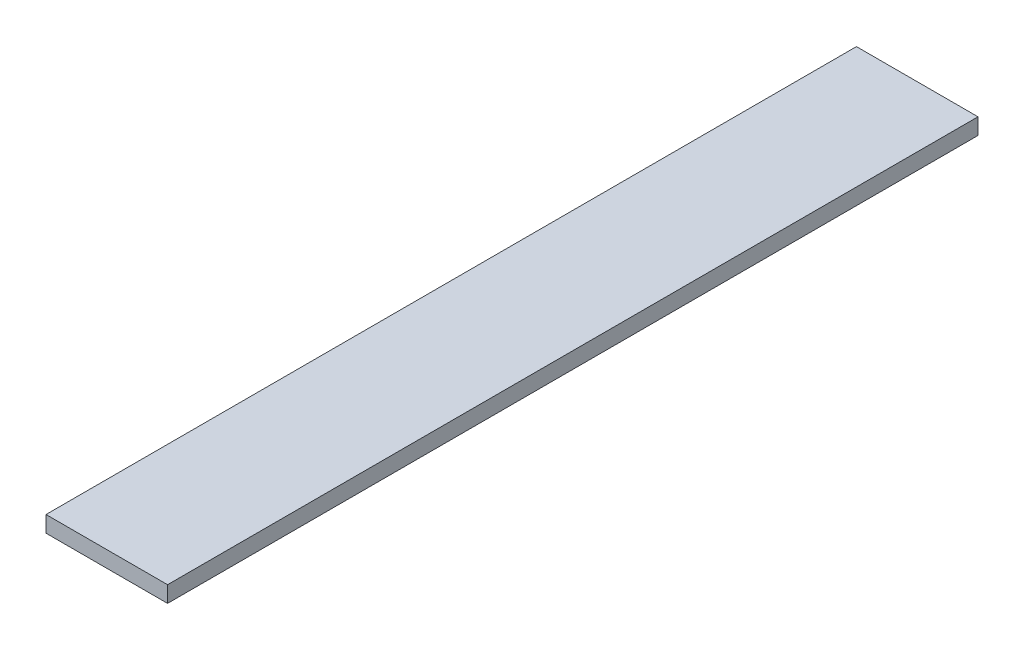
ISO-10303-21;
HEADER;
FILE_DESCRIPTION(('STEP AP214'),'2;1');
FILE_NAME('part.step','',(''),(''),'','','');
FILE_SCHEMA(('AUTOMOTIVE_DESIGN { 1 0 10303 214 1 1 1 1 }'));
ENDSEC;
DATA;
#1=APPLICATION_CONTEXT('core data for automotive mechanical design processes');
#2=APPLICATION_PROTOCOL_DEFINITION('international standard','automotive_design',2000,#1);
#3=PRODUCT_CONTEXT('',#1,'mechanical');
#4=PRODUCT('Part','Part','',(#3));
#5=PRODUCT_RELATED_PRODUCT_CATEGORY('part','',(#4));
#6=PRODUCT_DEFINITION_FORMATION('','',#4);
#7=PRODUCT_DEFINITION_CONTEXT('part definition',#1,'design');
#8=PRODUCT_DEFINITION('design','',#6,#7);
#9=PRODUCT_DEFINITION_SHAPE('','',#8);
#10=(LENGTH_UNIT() NAMED_UNIT(*) SI_UNIT(.MILLI.,.METRE.));
#11=(NAMED_UNIT(*) PLANE_ANGLE_UNIT() SI_UNIT($,.RADIAN.));
#12=(NAMED_UNIT(*) SI_UNIT($,.STERADIAN.) SOLID_ANGLE_UNIT());
#13=UNCERTAINTY_MEASURE_WITH_UNIT(LENGTH_MEASURE(1.E-05),#10,'distance_accuracy_value','');
#14=(GEOMETRIC_REPRESENTATION_CONTEXT(3) GLOBAL_UNCERTAINTY_ASSIGNED_CONTEXT((#13)) GLOBAL_UNIT_ASSIGNED_CONTEXT((#10,
#11,#12)) REPRESENTATION_CONTEXT('',''));
#15=CARTESIAN_POINT('',(0.,0.,0.));
#16=DIRECTION('',(0.,0.,1.));
#17=DIRECTION('',(1.,0.,0.));
#18=AXIS2_PLACEMENT_3D('',#15,#16,#17);
#19=CARTESIAN_POINT('',(75.,-10.,500.));
#20=DIRECTION('',(-1.,0.,0.));
#21=DIRECTION('',(0.,0.,1.));
#22=AXIS2_PLACEMENT_3D('',#19,#20,#21);
#23=PLANE('',#22);
#24=DIRECTION('',(0.,1.,0.));
#25=VECTOR('',#24,1.);
#26=CARTESIAN_POINT('',(75.,-10.,-500.));
#27=LINE('',#26,#25);
#28=CARTESIAN_POINT('',(75.,-10.,-500.));
#29=VERTEX_POINT('',#28);
#30=CARTESIAN_POINT('',(75.,10.,-500.));
#31=VERTEX_POINT('',#30);
#32=EDGE_CURVE('E99',#29,#31,#27,.T.);
#33=ORIENTED_EDGE('',*,*,#32,.T.);
#34=DIRECTION('',(0.,0.,-1.));
#35=VECTOR('',#34,1.);
#36=CARTESIAN_POINT('',(75.,10.,500.));
#37=LINE('',#36,#35);
#38=CARTESIAN_POINT('',(75.,10.,500.));
#39=VERTEX_POINT('',#38);
#40=EDGE_CURVE('E11',#39,#31,#37,.T.);
#41=ORIENTED_EDGE('',*,*,#40,.F.);
#42=DIRECTION('',(0.,1.,0.));
#43=VECTOR('',#42,1.);
#44=CARTESIAN_POINT('',(75.,-10.,500.));
#45=LINE('',#44,#43);
#46=CARTESIAN_POINT('',(75.,-10.,500.));
#47=VERTEX_POINT('',#46);
#48=EDGE_CURVE('E87',#47,#39,#45,.T.);
#49=ORIENTED_EDGE('',*,*,#48,.F.);
#50=DIRECTION('',(0.,0.,-1.));
#51=VECTOR('',#50,1.);
#52=CARTESIAN_POINT('',(75.,-10.,500.));
#53=LINE('',#52,#51);
#54=EDGE_CURVE('E95',#47,#29,#53,.T.);
#55=ORIENTED_EDGE('',*,*,#54,.T.);
#56=EDGE_LOOP('',(#33,#41,#49,#55));
#57=FACE_BOUND('',#56,.T.);
#58=ADVANCED_FACE('F36',(#57),#23,.F.);
#59=CARTESIAN_POINT('',(-75.,10.,500.));
#60=DIRECTION('',(0.,-1.,0.));
#61=DIRECTION('',(0.,0.,-1.));
#62=AXIS2_PLACEMENT_3D('',#59,#60,#61);
#63=PLANE('',#62);
#64=DIRECTION('',(-1.,0.,0.));
#65=VECTOR('',#64,1.);
#66=CARTESIAN_POINT('',(-75.,10.,-500.));
#67=LINE('',#66,#65);
#68=CARTESIAN_POINT('',(-75.,10.,-500.));
#69=VERTEX_POINT('',#68);
#70=EDGE_CURVE('E91',#31,#69,#67,.T.);
#71=ORIENTED_EDGE('',*,*,#70,.T.);
#72=DIRECTION('',(0.,0.,-1.));
#73=VECTOR('',#72,1.);
#74=CARTESIAN_POINT('',(-75.,10.,500.));
#75=LINE('',#74,#73);
#76=CARTESIAN_POINT('',(-75.,10.,500.));
#77=VERTEX_POINT('',#76);
#78=EDGE_CURVE('E44',#77,#69,#75,.T.);
#79=ORIENTED_EDGE('',*,*,#78,.F.);
#80=DIRECTION('',(-1.,0.,0.));
#81=VECTOR('',#80,1.);
#82=CARTESIAN_POINT('',(-75.,10.,500.));
#83=LINE('',#82,#81);
#84=EDGE_CURVE('E82',#39,#77,#83,.T.);
#85=ORIENTED_EDGE('',*,*,#84,.F.);
#86=ORIENTED_EDGE('',*,*,#40,.T.);
#87=EDGE_LOOP('',(#71,#79,#85,#86));
#88=FACE_BOUND('',#87,.T.);
#89=ADVANCED_FACE('F90',(#88),#63,.F.);
#90=CARTESIAN_POINT('',(-75.,-10.,500.));
#91=DIRECTION('',(1.,0.,0.));
#92=DIRECTION('',(0.,0.,-1.));
#93=AXIS2_PLACEMENT_3D('',#90,#91,#92);
#94=PLANE('',#93);
#95=DIRECTION('',(0.,-1.,0.));
#96=VECTOR('',#95,1.);
#97=CARTESIAN_POINT('',(-75.,-10.,-500.));
#98=LINE('',#97,#96);
#99=CARTESIAN_POINT('',(-75.,-10.,-500.));
#100=VERTEX_POINT('',#99);
#101=EDGE_CURVE('E69',#69,#100,#98,.T.);
#102=ORIENTED_EDGE('',*,*,#101,.T.);
#103=DIRECTION('',(0.,0.,-1.));
#104=VECTOR('',#103,1.);
#105=CARTESIAN_POINT('',(-75.,-10.,500.));
#106=LINE('',#105,#104);
#107=CARTESIAN_POINT('',(-75.,-10.,500.));
#108=VERTEX_POINT('',#107);
#109=EDGE_CURVE('E92',#108,#100,#106,.T.);
#110=ORIENTED_EDGE('',*,*,#109,.F.);
#111=DIRECTION('',(0.,-1.,0.));
#112=VECTOR('',#111,1.);
#113=CARTESIAN_POINT('',(-75.,-10.,500.));
#114=LINE('',#113,#112);
#115=EDGE_CURVE('E85',#77,#108,#114,.T.);
#116=ORIENTED_EDGE('',*,*,#115,.F.);
#117=ORIENTED_EDGE('',*,*,#78,.T.);
#118=EDGE_LOOP('',(#102,#110,#116,#117));
#119=FACE_BOUND('',#118,.T.);
#120=ADVANCED_FACE('F93',(#119),#94,.F.);
#121=CARTESIAN_POINT('',(-75.,-10.,500.));
#122=DIRECTION('',(0.,1.,0.));
#123=DIRECTION('',(0.,0.,1.));
#124=AXIS2_PLACEMENT_3D('',#121,#122,#123);
#125=PLANE('',#124);
#126=DIRECTION('',(1.,0.,0.));
#127=VECTOR('',#126,1.);
#128=CARTESIAN_POINT('',(-75.,-10.,-500.));
#129=LINE('',#128,#127);
#130=EDGE_CURVE('E75',#100,#29,#129,.T.);
#131=ORIENTED_EDGE('',*,*,#130,.T.);
#132=ORIENTED_EDGE('',*,*,#54,.F.);
#133=DIRECTION('',(1.,0.,0.));
#134=VECTOR('',#133,1.);
#135=CARTESIAN_POINT('',(-75.,-10.,500.));
#136=LINE('',#135,#134);
#137=EDGE_CURVE('E52',#108,#47,#136,.T.);
#138=ORIENTED_EDGE('',*,*,#137,.F.);
#139=ORIENTED_EDGE('',*,*,#109,.T.);
#140=EDGE_LOOP('',(#131,#132,#138,#139));
#141=FACE_BOUND('',#140,.T.);
#142=ADVANCED_FACE('F106',(#141),#125,.F.);
#143=CARTESIAN_POINT('',(0.,0.,500.));
#144=DIRECTION('',(0.,0.,-1.));
#145=DIRECTION('',(-1.,0.,0.));
#146=AXIS2_PLACEMENT_3D('',#143,#144,#145);
#147=PLANE('',#146);
#148=ORIENTED_EDGE('',*,*,#48,.T.);
#149=ORIENTED_EDGE('',*,*,#84,.T.);
#150=ORIENTED_EDGE('',*,*,#115,.T.);
#151=ORIENTED_EDGE('',*,*,#137,.T.);
#152=EDGE_LOOP('',(#148,#149,#150,#151));
#153=FACE_BOUND('',#152,.T.);
#154=ADVANCED_FACE('F83',(#153),#147,.F.);
#155=CARTESIAN_POINT('',(0.,0.,-500.));
#156=DIRECTION('',(0.,0.,-1.));
#157=DIRECTION('',(-1.,0.,0.));
#158=AXIS2_PLACEMENT_3D('',#155,#156,#157);
#159=PLANE('',#158);
#160=ORIENTED_EDGE('',*,*,#32,.F.);
#161=ORIENTED_EDGE('',*,*,#130,.F.);
#162=ORIENTED_EDGE('',*,*,#101,.F.);
#163=ORIENTED_EDGE('',*,*,#70,.F.);
#164=EDGE_LOOP('',(#160,#161,#162,#163));
#165=FACE_BOUND('',#164,.T.);
#166=ADVANCED_FACE('F109',(#165),#159,.T.);
#167=CLOSED_SHELL('',(#58,#89,#120,#142,#154,#166));
#168=MANIFOLD_SOLID_BREP('B2',#167);
#169=ADVANCED_BREP_SHAPE_REPRESENTATION('',(#18,#168),#14);
#170=SHAPE_DEFINITION_REPRESENTATION(#9,#169);
ENDSEC;
END-ISO-10303-21;
